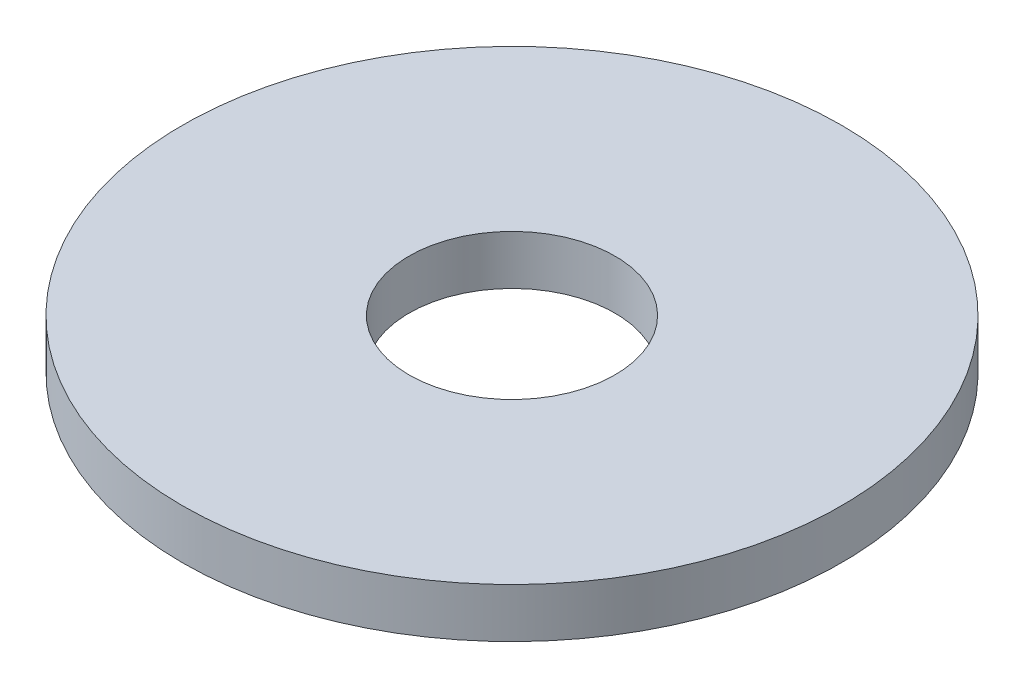
ISO-10303-21;
HEADER;
FILE_DESCRIPTION(('STEP AP214'),'2;1');
FILE_NAME('part.step','',(''),(''),'','','');
FILE_SCHEMA(('AUTOMOTIVE_DESIGN { 1 0 10303 214 1 1 1 1 }'));
ENDSEC;
DATA;
#1=APPLICATION_CONTEXT('core data for automotive mechanical design processes');
#2=APPLICATION_PROTOCOL_DEFINITION('international standard','automotive_design',2000,#1);
#3=PRODUCT_CONTEXT('',#1,'mechanical');
#4=PRODUCT('Part','Part','',(#3));
#5=PRODUCT_RELATED_PRODUCT_CATEGORY('part','',(#4));
#6=PRODUCT_DEFINITION_FORMATION('','',#4);
#7=PRODUCT_DEFINITION_CONTEXT('part definition',#1,'design');
#8=PRODUCT_DEFINITION('design','',#6,#7);
#9=PRODUCT_DEFINITION_SHAPE('','',#8);
#10=(LENGTH_UNIT() NAMED_UNIT(*) SI_UNIT(.MILLI.,.METRE.));
#11=(NAMED_UNIT(*) PLANE_ANGLE_UNIT() SI_UNIT($,.RADIAN.));
#12=(NAMED_UNIT(*) SI_UNIT($,.STERADIAN.) SOLID_ANGLE_UNIT());
#13=UNCERTAINTY_MEASURE_WITH_UNIT(LENGTH_MEASURE(1.E-05),#10,'distance_accuracy_value','');
#14=(GEOMETRIC_REPRESENTATION_CONTEXT(3) GLOBAL_UNCERTAINTY_ASSIGNED_CONTEXT((#13)) GLOBAL_UNIT_ASSIGNED_CONTEXT((#10,
#11,#12)) REPRESENTATION_CONTEXT('',''));
#15=CARTESIAN_POINT('',(0.,0.,0.));
#16=DIRECTION('',(0.,0.,1.));
#17=DIRECTION('',(1.,0.,0.));
#18=AXIS2_PLACEMENT_3D('',#15,#16,#17);
#19=CARTESIAN_POINT('',(0.,1.5,0.));
#20=DIRECTION('',(0.,1.,0.));
#21=DIRECTION('',(0.,0.,1.));
#22=AXIS2_PLACEMENT_3D('',#19,#20,#21);
#23=PLANE('',#22);
#24=CARTESIAN_POINT('',(0.,1.5,0.));
#25=DIRECTION('',(0.,1.,0.));
#26=DIRECTION('',(0.,0.,1.));
#27=AXIS2_PLACEMENT_3D('',#24,#25,#26);
#28=CIRCLE('',#27,20.);
#29=CARTESIAN_POINT('',(0.,1.5,20.));
#30=VERTEX_POINT('',#29);
#31=EDGE_CURVE('E10',#30,#30,#28,.T.);
#32=ORIENTED_EDGE('',*,*,#31,.T.);
#33=EDGE_LOOP('',(#32));
#34=FACE_BOUND('',#33,.T.);
#35=CARTESIAN_POINT('',(0.,1.5,0.));
#36=DIRECTION('',(0.,1.,0.));
#37=DIRECTION('',(0.,0.,1.));
#38=AXIS2_PLACEMENT_3D('',#35,#36,#37);
#39=CIRCLE('',#38,6.25);
#40=CARTESIAN_POINT('',(0.,1.5,6.25));
#41=VERTEX_POINT('',#40);
#42=EDGE_CURVE('E50',#41,#41,#39,.T.);
#43=ORIENTED_EDGE('',*,*,#42,.F.);
#44=EDGE_LOOP('',(#43));
#45=FACE_BOUND('',#44,.T.);
#46=ADVANCED_FACE('F39',(#34,#45),#23,.T.);
#47=CARTESIAN_POINT('',(0.,-1.5,0.));
#48=DIRECTION('',(0.,1.,0.));
#49=DIRECTION('',(0.,0.,1.));
#50=AXIS2_PLACEMENT_3D('',#47,#48,#49);
#51=PLANE('',#50);
#52=CARTESIAN_POINT('',(0.,-1.5,0.));
#53=DIRECTION('',(0.,1.,0.));
#54=DIRECTION('',(0.,0.,1.));
#55=AXIS2_PLACEMENT_3D('',#52,#53,#54);
#56=CIRCLE('',#55,20.);
#57=CARTESIAN_POINT('',(0.,-1.5,20.));
#58=VERTEX_POINT('',#57);
#59=EDGE_CURVE('E43',#58,#58,#56,.T.);
#60=ORIENTED_EDGE('',*,*,#59,.F.);
#61=EDGE_LOOP('',(#60));
#62=FACE_BOUND('',#61,.T.);
#63=CARTESIAN_POINT('',(0.,-1.5,0.));
#64=DIRECTION('',(0.,1.,0.));
#65=DIRECTION('',(0.,0.,1.));
#66=AXIS2_PLACEMENT_3D('',#63,#64,#65);
#67=CIRCLE('',#66,6.25);
#68=CARTESIAN_POINT('',(0.,-1.5,6.25));
#69=VERTEX_POINT('',#68);
#70=EDGE_CURVE('E52',#69,#69,#67,.T.);
#71=ORIENTED_EDGE('',*,*,#70,.T.);
#72=EDGE_LOOP('',(#71));
#73=FACE_BOUND('',#72,.T.);
#74=ADVANCED_FACE('F62',(#62,#73),#51,.F.);
#75=CARTESIAN_POINT('',(0.,1.5,0.));
#76=DIRECTION('',(0.,-1.,0.));
#77=DIRECTION('',(0.,0.,-1.));
#78=AXIS2_PLACEMENT_3D('',#75,#76,#77);
#79=CYLINDRICAL_SURFACE('',#78,20.);
#80=ORIENTED_EDGE('',*,*,#31,.F.);
#81=EDGE_LOOP('',(#80));
#82=FACE_BOUND('',#81,.T.);
#83=ORIENTED_EDGE('',*,*,#59,.T.);
#84=EDGE_LOOP('',(#83));
#85=FACE_BOUND('',#84,.T.);
#86=ADVANCED_FACE('F41',(#82,#85),#79,.T.);
#87=CARTESIAN_POINT('',(0.,1.5,0.));
#88=DIRECTION('',(0.,-1.,0.));
#89=DIRECTION('',(0.,0.,-1.));
#90=AXIS2_PLACEMENT_3D('',#87,#88,#89);
#91=CYLINDRICAL_SURFACE('',#90,6.25);
#92=ORIENTED_EDGE('',*,*,#42,.T.);
#93=EDGE_LOOP('',(#92));
#94=FACE_BOUND('',#93,.T.);
#95=ORIENTED_EDGE('',*,*,#70,.F.);
#96=EDGE_LOOP('',(#95));
#97=FACE_BOUND('',#96,.T.);
#98=ADVANCED_FACE('F58',(#94,#97),#91,.F.);
#99=CLOSED_SHELL('',(#46,#74,#86,#98));
#100=MANIFOLD_SOLID_BREP('B2',#99);
#101=ADVANCED_BREP_SHAPE_REPRESENTATION('',(#18,#100),#14);
#102=SHAPE_DEFINITION_REPRESENTATION(#9,#101);
ENDSEC;
END-ISO-10303-21;
